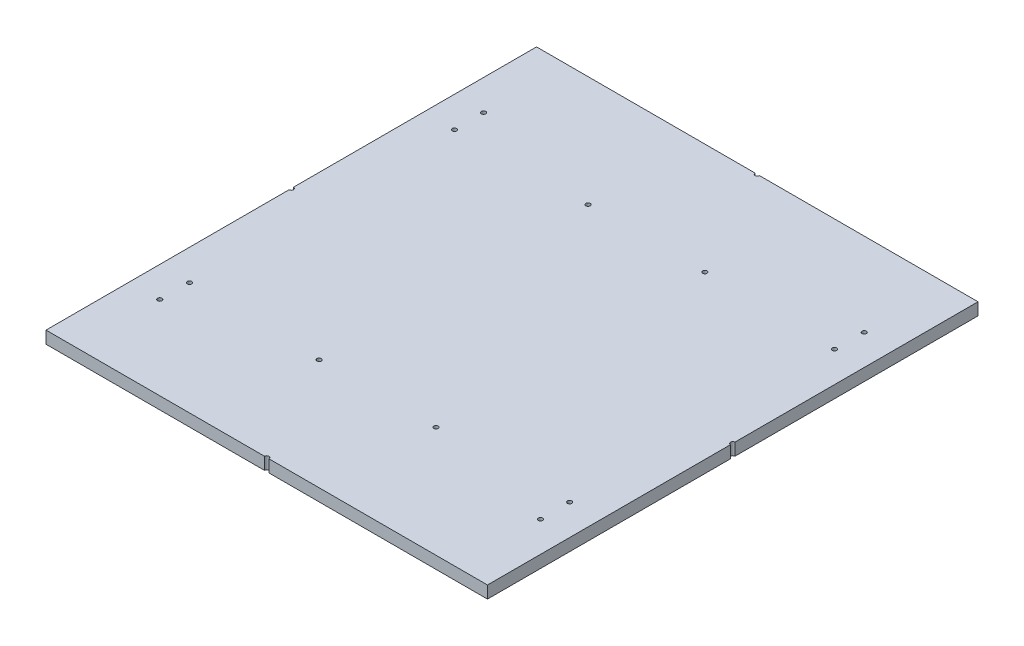
ISO-10303-21;
HEADER;
FILE_DESCRIPTION(('STEP AP214'),'2;1');
FILE_NAME('part.step','',(''),(''),'','','');
FILE_SCHEMA(('AUTOMOTIVE_DESIGN { 1 0 10303 214 1 1 1 1 }'));
ENDSEC;
DATA;
#1=APPLICATION_CONTEXT('core data for automotive mechanical design processes');
#2=APPLICATION_PROTOCOL_DEFINITION('international standard','automotive_design',2000,#1);
#3=PRODUCT_CONTEXT('',#1,'mechanical');
#4=PRODUCT('Part','Part','',(#3));
#5=PRODUCT_RELATED_PRODUCT_CATEGORY('part','',(#4));
#6=PRODUCT_DEFINITION_FORMATION('','',#4);
#7=PRODUCT_DEFINITION_CONTEXT('part definition',#1,'design');
#8=PRODUCT_DEFINITION('design','',#6,#7);
#9=PRODUCT_DEFINITION_SHAPE('','',#8);
#10=(LENGTH_UNIT() NAMED_UNIT(*) SI_UNIT(.MILLI.,.METRE.));
#11=(NAMED_UNIT(*) PLANE_ANGLE_UNIT() SI_UNIT($,.RADIAN.));
#12=(NAMED_UNIT(*) SI_UNIT($,.STERADIAN.) SOLID_ANGLE_UNIT());
#13=UNCERTAINTY_MEASURE_WITH_UNIT(LENGTH_MEASURE(1.E-05),#10,'distance_accuracy_value','');
#14=(GEOMETRIC_REPRESENTATION_CONTEXT(3) GLOBAL_UNCERTAINTY_ASSIGNED_CONTEXT((#13)) GLOBAL_UNIT_ASSIGNED_CONTEXT((#10,
#11,#12)) REPRESENTATION_CONTEXT('',''));
#15=CARTESIAN_POINT('',(0.,0.,0.));
#16=DIRECTION('',(0.,0.,1.));
#17=DIRECTION('',(1.,0.,0.));
#18=AXIS2_PLACEMENT_3D('',#15,#16,#17);
#19=CARTESIAN_POINT('',(0.,6.35,0.));
#20=DIRECTION('',(1.,0.,0.));
#21=DIRECTION('',(0.,0.,-1.));
#22=AXIS2_PLACEMENT_3D('',#19,#20,#21);
#23=PLANE('',#22);
#24=DIRECTION('',(0.,0.,1.));
#25=VECTOR('',#24,1.);
#26=CARTESIAN_POINT('',(0.,0.,0.));
#27=LINE('',#26,#25);
#28=CARTESIAN_POINT('',(0.,0.,-254.));
#29=VERTEX_POINT('',#28);
#30=CARTESIAN_POINT('',(0.,0.,-128.1303));
#31=VERTEX_POINT('',#30);
#32=EDGE_CURVE('E167',#29,#31,#27,.T.);
#33=ORIENTED_EDGE('',*,*,#32,.T.);
#34=DIRECTION('',(0.,1.,0.));
#35=VECTOR('',#34,1.);
#36=CARTESIAN_POINT('',(0.,6.35,-128.1303));
#37=LINE('',#36,#35);
#38=CARTESIAN_POINT('',(0.,6.35,-128.1303));
#39=VERTEX_POINT('',#38);
#40=EDGE_CURVE('E145',#31,#39,#37,.T.);
#41=ORIENTED_EDGE('',*,*,#40,.T.);
#42=DIRECTION('',(0.,0.,1.));
#43=VECTOR('',#42,1.);
#44=CARTESIAN_POINT('',(0.,6.35,0.));
#45=LINE('',#44,#43);
#46=CARTESIAN_POINT('',(0.,6.35,-254.));
#47=VERTEX_POINT('',#46);
#48=EDGE_CURVE('E236',#47,#39,#45,.T.);
#49=ORIENTED_EDGE('',*,*,#48,.F.);
#50=DIRECTION('',(0.,-1.,0.));
#51=VECTOR('',#50,1.);
#52=CARTESIAN_POINT('',(0.,6.35,-254.));
#53=LINE('',#52,#51);
#54=EDGE_CURVE('E193',#47,#29,#53,.T.);
#55=ORIENTED_EDGE('',*,*,#54,.T.);
#56=EDGE_LOOP('',(#33,#41,#49,#55));
#57=FACE_BOUND('',#56,.T.);
#58=ADVANCED_FACE('F52',(#57),#23,.F.);
#59=CARTESIAN_POINT('',(0.,0.,0.));
#60=DIRECTION('',(0.,-1.,0.));
#61=DIRECTION('',(0.,0.,-1.));
#62=AXIS2_PLACEMENT_3D('',#59,#60,#61);
#63=PLANE('',#62);
#64=CARTESIAN_POINT('',(15.7351594072584,0.,-43.18));
#65=DIRECTION('',(0.,1.,0.));
#66=DIRECTION('',(0.,0.,1.));
#67=AXIS2_PLACEMENT_3D('',#64,#65,#66);
#68=CIRCLE('',#67,1.1303);
#69=CARTESIAN_POINT('',(15.7351594072584,0.,-42.0497));
#70=VERTEX_POINT('',#69);
#71=EDGE_CURVE('E684',#70,#70,#68,.T.);
#72=ORIENTED_EDGE('',*,*,#71,.T.);
#73=EDGE_LOOP('',(#72));
#74=FACE_BOUND('',#73,.T.);
#75=CARTESIAN_POINT('',(15.8749999999998,0.,-58.42));
#76=DIRECTION('',(0.,1.,0.));
#77=DIRECTION('',(0.,0.,1.));
#78=AXIS2_PLACEMENT_3D('',#75,#76,#77);
#79=CIRCLE('',#78,1.1303);
#80=CARTESIAN_POINT('',(15.8749999999998,0.,-57.2897));
#81=VERTEX_POINT('',#80);
#82=EDGE_CURVE('E694',#81,#81,#79,.T.);
#83=ORIENTED_EDGE('',*,*,#82,.T.);
#84=EDGE_LOOP('',(#83));
#85=FACE_BOUND('',#84,.T.);
#86=CARTESIAN_POINT('',(84.0588414103042,0.,-57.3884371810008));
#87=DIRECTION('',(0.,1.,0.));
#88=DIRECTION('',(0.,0.,1.));
#89=AXIS2_PLACEMENT_3D('',#86,#87,#88);
#90=CIRCLE('',#89,1.1303);
#91=CARTESIAN_POINT('',(84.0588414103042,0.,-56.2581371810008));
#92=VERTEX_POINT('',#91);
#93=EDGE_CURVE('E703',#92,#92,#90,.T.);
#94=ORIENTED_EDGE('',*,*,#93,.T.);
#95=EDGE_LOOP('',(#94));
#96=FACE_BOUND('',#95,.T.);
#97=CARTESIAN_POINT('',(144.561688198213,0.,-57.3884371810008));
#98=DIRECTION('',(0.,1.,0.));
#99=DIRECTION('',(0.,0.,1.));
#100=AXIS2_PLACEMENT_3D('',#97,#98,#99);
#101=CIRCLE('',#100,1.1303);
#102=CARTESIAN_POINT('',(144.561688198213,0.,-56.2581371810008));
#103=VERTEX_POINT('',#102);
#104=EDGE_CURVE('E711',#103,#103,#101,.T.);
#105=ORIENTED_EDGE('',*,*,#104,.T.);
#106=EDGE_LOOP('',(#105));
#107=FACE_BOUND('',#106,.T.);
#108=CARTESIAN_POINT('',(0.,0.,-127.));
#109=DIRECTION('',(0.,1.,0.));
#110=DIRECTION('',(0.,0.,1.));
#111=AXIS2_PLACEMENT_3D('',#108,#109,#110);
#112=CIRCLE('',#111,1.1303);
#113=CARTESIAN_POINT('',(0.,0.,-125.8697));
#114=VERTEX_POINT('',#113);
#115=EDGE_CURVE('E143',#114,#31,#112,.T.);
#116=ORIENTED_EDGE('',*,*,#115,.T.);
#117=ORIENTED_EDGE('',*,*,#32,.F.);
#118=DIRECTION('',(-1.,0.,0.));
#119=VECTOR('',#118,1.);
#120=CARTESIAN_POINT('',(0.,0.,-254.));
#121=LINE('',#120,#119);
#122=CARTESIAN_POINT('',(113.1697,0.,-254.));
#123=VERTEX_POINT('',#122);
#124=EDGE_CURVE('E188',#123,#29,#121,.T.);
#125=ORIENTED_EDGE('',*,*,#124,.F.);
#126=CARTESIAN_POINT('',(114.3,0.,-254.));
#127=DIRECTION('',(0.,-1.,0.));
#128=DIRECTION('',(0.,0.,-1.));
#129=AXIS2_PLACEMENT_3D('',#126,#127,#128);
#130=CIRCLE('',#129,1.13029999999999);
#131=CARTESIAN_POINT('',(115.4303,0.,-254.));
#132=VERTEX_POINT('',#131);
#133=EDGE_CURVE('E206',#132,#123,#130,.T.);
#134=ORIENTED_EDGE('',*,*,#133,.F.);
#135=CARTESIAN_POINT('',(228.6,0.,-254.));
#136=VERTEX_POINT('',#135);
#137=EDGE_CURVE('E189',#136,#132,#121,.T.);
#138=ORIENTED_EDGE('',*,*,#137,.F.);
#139=DIRECTION('',(0.,0.,-1.));
#140=VECTOR('',#139,1.);
#141=CARTESIAN_POINT('',(228.6,0.,0.));
#142=LINE('',#141,#140);
#143=CARTESIAN_POINT('',(228.6,0.,-128.1303));
#144=VERTEX_POINT('',#143);
#145=EDGE_CURVE('E182',#144,#136,#142,.T.);
#146=ORIENTED_EDGE('',*,*,#145,.F.);
#147=CARTESIAN_POINT('',(228.6,0.,-127.));
#148=DIRECTION('',(0.,1.,0.));
#149=DIRECTION('',(0.,0.,1.));
#150=AXIS2_PLACEMENT_3D('',#147,#148,#149);
#151=CIRCLE('',#150,1.1303);
#152=CARTESIAN_POINT('',(228.6,0.,-125.8697));
#153=VERTEX_POINT('',#152);
#154=EDGE_CURVE('E209',#144,#153,#151,.T.);
#155=ORIENTED_EDGE('',*,*,#154,.T.);
#156=CARTESIAN_POINT('',(228.6,0.,0.));
#157=VERTEX_POINT('',#156);
#158=EDGE_CURVE('E185',#157,#153,#142,.T.);
#159=ORIENTED_EDGE('',*,*,#158,.F.);
#160=DIRECTION('',(1.,0.,0.));
#161=VECTOR('',#160,1.);
#162=CARTESIAN_POINT('',(0.,0.,0.));
#163=LINE('',#162,#161);
#164=CARTESIAN_POINT('',(115.4303,0.,0.));
#165=VERTEX_POINT('',#164);
#166=EDGE_CURVE('E173',#165,#157,#163,.T.);
#167=ORIENTED_EDGE('',*,*,#166,.F.);
#168=CARTESIAN_POINT('',(114.3,0.,0.));
#169=DIRECTION('',(0.,1.,0.));
#170=DIRECTION('',(0.,0.,1.));
#171=AXIS2_PLACEMENT_3D('',#168,#169,#170);
#172=CIRCLE('',#171,1.1303);
#173=CARTESIAN_POINT('',(113.1697,0.,0.));
#174=VERTEX_POINT('',#173);
#175=EDGE_CURVE('E79',#165,#174,#172,.T.);
#176=ORIENTED_EDGE('',*,*,#175,.T.);
#177=CARTESIAN_POINT('',(0.,0.,0.));
#178=VERTEX_POINT('',#177);
#179=EDGE_CURVE('E162',#178,#174,#163,.T.);
#180=ORIENTED_EDGE('',*,*,#179,.F.);
#181=EDGE_CURVE('E154',#114,#178,#27,.T.);
#182=ORIENTED_EDGE('',*,*,#181,.F.);
#183=EDGE_LOOP('',(#116,#117,#125,#134,#138,#146,#155,#159,#167,#176,#180,#182));
#184=FACE_BOUND('',#183,.T.);
#185=CARTESIAN_POINT('',(144.561688198213,0.,-196.611562818999));
#186=DIRECTION('',(0.,1.,0.));
#187=DIRECTION('',(0.,0.,1.));
#188=AXIS2_PLACEMENT_3D('',#185,#186,#187);
#189=CIRCLE('',#188,1.1303);
#190=CARTESIAN_POINT('',(144.561688198213,0.,-195.481262818999));
#191=VERTEX_POINT('',#190);
#192=EDGE_CURVE('E327',#191,#191,#189,.T.);
#193=ORIENTED_EDGE('',*,*,#192,.T.);
#194=EDGE_LOOP('',(#193));
#195=FACE_BOUND('',#194,.T.);
#196=CARTESIAN_POINT('',(84.0588414103042,0.,-196.611562818999));
#197=DIRECTION('',(0.,1.,0.));
#198=DIRECTION('',(0.,0.,1.));
#199=AXIS2_PLACEMENT_3D('',#196,#197,#198);
#200=CIRCLE('',#199,1.1303);
#201=CARTESIAN_POINT('',(84.0588414103042,0.,-195.481262818999));
#202=VERTEX_POINT('',#201);
#203=EDGE_CURVE('E337',#202,#202,#200,.T.);
#204=ORIENTED_EDGE('',*,*,#203,.T.);
#205=EDGE_LOOP('',(#204));
#206=FACE_BOUND('',#205,.T.);
#207=CARTESIAN_POINT('',(15.8749999999998,0.,-195.58));
#208=DIRECTION('',(0.,1.,0.));
#209=DIRECTION('',(0.,0.,1.));
#210=AXIS2_PLACEMENT_3D('',#207,#208,#209);
#211=CIRCLE('',#210,1.1303);
#212=CARTESIAN_POINT('',(15.8749999999998,0.,-194.4497));
#213=VERTEX_POINT('',#212);
#214=EDGE_CURVE('E347',#213,#213,#211,.T.);
#215=ORIENTED_EDGE('',*,*,#214,.T.);
#216=EDGE_LOOP('',(#215));
#217=FACE_BOUND('',#216,.T.);
#218=CARTESIAN_POINT('',(15.7351594072584,0.,-210.82));
#219=DIRECTION('',(0.,1.,0.));
#220=DIRECTION('',(0.,0.,1.));
#221=AXIS2_PLACEMENT_3D('',#218,#219,#220);
#222=CIRCLE('',#221,1.1303);
#223=CARTESIAN_POINT('',(15.7351594072584,0.,-209.6897));
#224=VERTEX_POINT('',#223);
#225=EDGE_CURVE('E355',#224,#224,#222,.T.);
#226=ORIENTED_EDGE('',*,*,#225,.T.);
#227=EDGE_LOOP('',(#226));
#228=FACE_BOUND('',#227,.T.);
#229=CARTESIAN_POINT('',(212.864840592742,0.,-43.18));
#230=DIRECTION('',(0.,1.,0.));
#231=DIRECTION('',(0.,0.,1.));
#232=AXIS2_PLACEMENT_3D('',#229,#230,#231);
#233=CIRCLE('',#232,1.1303);
#234=CARTESIAN_POINT('',(212.864840592742,0.,-42.0497));
#235=VERTEX_POINT('',#234);
#236=EDGE_CURVE('E370',#235,#235,#233,.T.);
#237=ORIENTED_EDGE('',*,*,#236,.T.);
#238=EDGE_LOOP('',(#237));
#239=FACE_BOUND('',#238,.T.);
#240=CARTESIAN_POINT('',(212.725,0.,-58.42));
#241=DIRECTION('',(0.,1.,0.));
#242=DIRECTION('',(0.,0.,1.));
#243=AXIS2_PLACEMENT_3D('',#240,#241,#242);
#244=CIRCLE('',#243,1.1303);
#245=CARTESIAN_POINT('',(212.725,0.,-57.2897));
#246=VERTEX_POINT('',#245);
#247=EDGE_CURVE('E374',#246,#246,#244,.T.);
#248=ORIENTED_EDGE('',*,*,#247,.T.);
#249=EDGE_LOOP('',(#248));
#250=FACE_BOUND('',#249,.T.);
#251=CARTESIAN_POINT('',(212.864840592742,0.,-210.82));
#252=DIRECTION('',(0.,1.,0.));
#253=DIRECTION('',(0.,0.,1.));
#254=AXIS2_PLACEMENT_3D('',#251,#252,#253);
#255=CIRCLE('',#254,1.1303);
#256=CARTESIAN_POINT('',(212.864840592742,0.,-209.6897));
#257=VERTEX_POINT('',#256);
#258=EDGE_CURVE('E382',#257,#257,#255,.T.);
#259=ORIENTED_EDGE('',*,*,#258,.T.);
#260=EDGE_LOOP('',(#259));
#261=FACE_BOUND('',#260,.T.);
#262=CARTESIAN_POINT('',(212.725,0.,-195.58));
#263=DIRECTION('',(0.,1.,0.));
#264=DIRECTION('',(0.,0.,1.));
#265=AXIS2_PLACEMENT_3D('',#262,#263,#264);
#266=CIRCLE('',#265,1.1303);
#267=CARTESIAN_POINT('',(212.725,0.,-194.4497));
#268=VERTEX_POINT('',#267);
#269=EDGE_CURVE('E227',#268,#268,#266,.T.);
#270=ORIENTED_EDGE('',*,*,#269,.T.);
#271=EDGE_LOOP('',(#270));
#272=FACE_BOUND('',#271,.T.);
#273=ADVANCED_FACE('F159',(#74,#85,#96,#107,#184,#195,#206,#217,#228,#239,#250,#261,#272),#63,.T.);
#274=CARTESIAN_POINT('',(0.,6.35,0.));
#275=DIRECTION('',(0.,-1.,0.));
#276=DIRECTION('',(0.,0.,-1.));
#277=AXIS2_PLACEMENT_3D('',#274,#275,#276);
#278=PLANE('',#277);
#279=CARTESIAN_POINT('',(15.7351594072584,6.35,-43.18));
#280=DIRECTION('',(0.,1.,0.));
#281=DIRECTION('',(0.,0.,1.));
#282=AXIS2_PLACEMENT_3D('',#279,#280,#281);
#283=CIRCLE('',#282,1.13029999999999);
#284=CARTESIAN_POINT('',(15.7351594072584,6.35,-42.0497));
#285=VERTEX_POINT('',#284);
#286=EDGE_CURVE('E681',#285,#285,#283,.T.);
#287=ORIENTED_EDGE('',*,*,#286,.F.);
#288=EDGE_LOOP('',(#287));
#289=FACE_BOUND('',#288,.T.);
#290=CARTESIAN_POINT('',(15.8749999999998,6.35,-58.42));
#291=DIRECTION('',(0.,1.,0.));
#292=DIRECTION('',(0.,0.,1.));
#293=AXIS2_PLACEMENT_3D('',#290,#291,#292);
#294=CIRCLE('',#293,1.13029999999999);
#295=CARTESIAN_POINT('',(15.8749999999998,6.35,-57.2897));
#296=VERTEX_POINT('',#295);
#297=EDGE_CURVE('E690',#296,#296,#294,.T.);
#298=ORIENTED_EDGE('',*,*,#297,.F.);
#299=EDGE_LOOP('',(#298));
#300=FACE_BOUND('',#299,.T.);
#301=CARTESIAN_POINT('',(84.0588414103042,6.35,-57.3884371810008));
#302=DIRECTION('',(0.,1.,0.));
#303=DIRECTION('',(0.,0.,1.));
#304=AXIS2_PLACEMENT_3D('',#301,#302,#303);
#305=CIRCLE('',#304,1.13029999999999);
#306=CARTESIAN_POINT('',(84.0588414103042,6.35,-56.2581371810008));
#307=VERTEX_POINT('',#306);
#308=EDGE_CURVE('E699',#307,#307,#305,.T.);
#309=ORIENTED_EDGE('',*,*,#308,.F.);
#310=EDGE_LOOP('',(#309));
#311=FACE_BOUND('',#310,.T.);
#312=CARTESIAN_POINT('',(144.561688198213,6.35,-57.3884371810008));
#313=DIRECTION('',(0.,1.,0.));
#314=DIRECTION('',(0.,0.,1.));
#315=AXIS2_PLACEMENT_3D('',#312,#313,#314);
#316=CIRCLE('',#315,1.1303);
#317=CARTESIAN_POINT('',(144.561688198213,6.35,-56.2581371810008));
#318=VERTEX_POINT('',#317);
#319=EDGE_CURVE('E710',#318,#318,#316,.T.);
#320=ORIENTED_EDGE('',*,*,#319,.F.);
#321=EDGE_LOOP('',(#320));
#322=FACE_BOUND('',#321,.T.);
#323=CARTESIAN_POINT('',(144.561688198213,6.35,-196.611562818999));
#324=DIRECTION('',(0.,1.,0.));
#325=DIRECTION('',(0.,0.,1.));
#326=AXIS2_PLACEMENT_3D('',#323,#324,#325);
#327=CIRCLE('',#326,1.1303);
#328=CARTESIAN_POINT('',(144.561688198213,6.35,-195.481262818999));
#329=VERTEX_POINT('',#328);
#330=EDGE_CURVE('E322',#329,#329,#327,.T.);
#331=ORIENTED_EDGE('',*,*,#330,.F.);
#332=EDGE_LOOP('',(#331));
#333=FACE_BOUND('',#332,.T.);
#334=CARTESIAN_POINT('',(84.0588414103042,6.35,-196.611562818999));
#335=DIRECTION('',(0.,1.,0.));
#336=DIRECTION('',(0.,0.,1.));
#337=AXIS2_PLACEMENT_3D('',#334,#335,#336);
#338=CIRCLE('',#337,1.13029999999999);
#339=CARTESIAN_POINT('',(84.0588414103042,6.35,-195.481262818999));
#340=VERTEX_POINT('',#339);
#341=EDGE_CURVE('E331',#340,#340,#338,.T.);
#342=ORIENTED_EDGE('',*,*,#341,.F.);
#343=EDGE_LOOP('',(#342));
#344=FACE_BOUND('',#343,.T.);
#345=CARTESIAN_POINT('',(15.8749999999998,6.35,-195.58));
#346=DIRECTION('',(0.,1.,0.));
#347=DIRECTION('',(0.,0.,1.));
#348=AXIS2_PLACEMENT_3D('',#345,#346,#347);
#349=CIRCLE('',#348,1.13029999999999);
#350=CARTESIAN_POINT('',(15.8749999999998,6.35,-194.4497));
#351=VERTEX_POINT('',#350);
#352=EDGE_CURVE('E344',#351,#351,#349,.T.);
#353=ORIENTED_EDGE('',*,*,#352,.F.);
#354=EDGE_LOOP('',(#353));
#355=FACE_BOUND('',#354,.T.);
#356=CARTESIAN_POINT('',(15.7351594072584,6.35,-210.82));
#357=DIRECTION('',(0.,1.,0.));
#358=DIRECTION('',(0.,0.,1.));
#359=AXIS2_PLACEMENT_3D('',#356,#357,#358);
#360=CIRCLE('',#359,1.13029999999999);
#361=CARTESIAN_POINT('',(15.7351594072584,6.35,-209.6897));
#362=VERTEX_POINT('',#361);
#363=EDGE_CURVE('E348',#362,#362,#360,.T.);
#364=ORIENTED_EDGE('',*,*,#363,.F.);
#365=EDGE_LOOP('',(#364));
#366=FACE_BOUND('',#365,.T.);
#367=CARTESIAN_POINT('',(212.725,6.35,-195.58));
#368=DIRECTION('',(0.,1.,0.));
#369=DIRECTION('',(0.,0.,1.));
#370=AXIS2_PLACEMENT_3D('',#367,#368,#369);
#371=CIRCLE('',#370,1.13029999999997);
#372=CARTESIAN_POINT('',(212.725,6.35,-194.4497));
#373=VERTEX_POINT('',#372);
#374=EDGE_CURVE('E390',#373,#373,#371,.T.);
#375=ORIENTED_EDGE('',*,*,#374,.F.);
#376=EDGE_LOOP('',(#375));
#377=FACE_BOUND('',#376,.T.);
#378=CARTESIAN_POINT('',(212.864840592742,6.35,-210.82));
#379=DIRECTION('',(0.,1.,0.));
#380=DIRECTION('',(0.,0.,1.));
#381=AXIS2_PLACEMENT_3D('',#378,#379,#380);
#382=CIRCLE('',#381,1.13029999999997);
#383=CARTESIAN_POINT('',(212.864840592742,6.35,-209.6897));
#384=VERTEX_POINT('',#383);
#385=EDGE_CURVE('E377',#384,#384,#382,.T.);
#386=ORIENTED_EDGE('',*,*,#385,.F.);
#387=EDGE_LOOP('',(#386));
#388=FACE_BOUND('',#387,.T.);
#389=CARTESIAN_POINT('',(212.725,6.35,-58.42));
#390=DIRECTION('',(0.,1.,0.));
#391=DIRECTION('',(0.,0.,1.));
#392=AXIS2_PLACEMENT_3D('',#389,#390,#391);
#393=CIRCLE('',#392,1.13029999999997);
#394=CARTESIAN_POINT('',(212.725,6.35,-57.2897));
#395=VERTEX_POINT('',#394);
#396=EDGE_CURVE('E371',#395,#395,#393,.T.);
#397=ORIENTED_EDGE('',*,*,#396,.F.);
#398=EDGE_LOOP('',(#397));
#399=FACE_BOUND('',#398,.T.);
#400=CARTESIAN_POINT('',(212.864840592742,6.35,-43.18));
#401=DIRECTION('',(0.,1.,0.));
#402=DIRECTION('',(0.,0.,1.));
#403=AXIS2_PLACEMENT_3D('',#400,#401,#402);
#404=CIRCLE('',#403,1.13029999999997);
#405=CARTESIAN_POINT('',(212.864840592742,6.35,-42.0497));
#406=VERTEX_POINT('',#405);
#407=EDGE_CURVE('E361',#406,#406,#404,.T.);
#408=ORIENTED_EDGE('',*,*,#407,.F.);
#409=EDGE_LOOP('',(#408));
#410=FACE_BOUND('',#409,.T.);
#411=ORIENTED_EDGE('',*,*,#48,.T.);
#412=CARTESIAN_POINT('',(0.,6.35,-127.));
#413=DIRECTION('',(0.,1.,0.));
#414=DIRECTION('',(0.,0.,1.));
#415=AXIS2_PLACEMENT_3D('',#412,#413,#414);
#416=CIRCLE('',#415,1.13029999999999);
#417=CARTESIAN_POINT('',(0.,6.35,-125.8697));
#418=VERTEX_POINT('',#417);
#419=EDGE_CURVE('E147',#418,#39,#416,.T.);
#420=ORIENTED_EDGE('',*,*,#419,.F.);
#421=CARTESIAN_POINT('',(0.,6.35,0.));
#422=VERTEX_POINT('',#421);
#423=EDGE_CURVE('E160',#418,#422,#45,.T.);
#424=ORIENTED_EDGE('',*,*,#423,.T.);
#425=DIRECTION('',(1.,0.,0.));
#426=VECTOR('',#425,1.);
#427=CARTESIAN_POINT('',(0.,6.35,0.));
#428=LINE('',#427,#426);
#429=CARTESIAN_POINT('',(113.1697,6.35,0.));
#430=VERTEX_POINT('',#429);
#431=EDGE_CURVE('E242',#422,#430,#428,.T.);
#432=ORIENTED_EDGE('',*,*,#431,.T.);
#433=CARTESIAN_POINT('',(114.3,6.35,0.));
#434=DIRECTION('',(0.,1.,0.));
#435=DIRECTION('',(0.,0.,1.));
#436=AXIS2_PLACEMENT_3D('',#433,#434,#435);
#437=CIRCLE('',#436,1.13029999999999);
#438=CARTESIAN_POINT('',(115.4303,6.35,0.));
#439=VERTEX_POINT('',#438);
#440=EDGE_CURVE('E357',#439,#430,#437,.T.);
#441=ORIENTED_EDGE('',*,*,#440,.F.);
#442=CARTESIAN_POINT('',(228.6,6.35,0.));
#443=VERTEX_POINT('',#442);
#444=EDGE_CURVE('E244',#439,#443,#428,.T.);
#445=ORIENTED_EDGE('',*,*,#444,.T.);
#446=DIRECTION('',(0.,0.,-1.));
#447=VECTOR('',#446,1.);
#448=CARTESIAN_POINT('',(228.6,6.35,0.));
#449=LINE('',#448,#447);
#450=CARTESIAN_POINT('',(228.6,6.35,-125.8697));
#451=VERTEX_POINT('',#450);
#452=EDGE_CURVE('E249',#443,#451,#449,.T.);
#453=ORIENTED_EDGE('',*,*,#452,.T.);
#454=CARTESIAN_POINT('',(228.6,6.35,-127.));
#455=DIRECTION('',(0.,1.,0.));
#456=DIRECTION('',(0.,0.,1.));
#457=AXIS2_PLACEMENT_3D('',#454,#455,#456);
#458=CIRCLE('',#457,1.13029999999997);
#459=CARTESIAN_POINT('',(228.6,6.35,-128.1303));
#460=VERTEX_POINT('',#459);
#461=EDGE_CURVE('E208',#460,#451,#458,.T.);
#462=ORIENTED_EDGE('',*,*,#461,.F.);
#463=CARTESIAN_POINT('',(228.6,6.35,-254.));
#464=VERTEX_POINT('',#463);
#465=EDGE_CURVE('E248',#460,#464,#449,.T.);
#466=ORIENTED_EDGE('',*,*,#465,.T.);
#467=DIRECTION('',(-1.,0.,0.));
#468=VECTOR('',#467,1.);
#469=CARTESIAN_POINT('',(0.,6.35,-254.));
#470=LINE('',#469,#468);
#471=CARTESIAN_POINT('',(115.4303,6.35,-254.));
#472=VERTEX_POINT('',#471);
#473=EDGE_CURVE('E179',#464,#472,#470,.T.);
#474=ORIENTED_EDGE('',*,*,#473,.T.);
#475=CARTESIAN_POINT('',(114.3,6.35,-254.));
#476=DIRECTION('',(0.,1.,0.));
#477=DIRECTION('',(0.,0.,1.));
#478=AXIS2_PLACEMENT_3D('',#475,#476,#477);
#479=CIRCLE('',#478,1.13029999999999);
#480=CARTESIAN_POINT('',(113.1697,6.35,-254.));
#481=VERTEX_POINT('',#480);
#482=EDGE_CURVE('E234',#481,#472,#479,.T.);
#483=ORIENTED_EDGE('',*,*,#482,.F.);
#484=EDGE_CURVE('E246',#481,#47,#470,.T.);
#485=ORIENTED_EDGE('',*,*,#484,.T.);
#486=EDGE_LOOP('',(#411,#420,#424,#432,#441,#445,#453,#462,#466,#474,#483,#485));
#487=FACE_BOUND('',#486,.T.);
#488=ADVANCED_FACE('F259',(#289,#300,#311,#322,#333,#344,#355,#366,#377,#388,#399,#410,#487),
#278,.F.);
#489=CARTESIAN_POINT('',(0.,6.35,0.));
#490=DIRECTION('',(0.,0.,-1.));
#491=DIRECTION('',(-1.,0.,0.));
#492=AXIS2_PLACEMENT_3D('',#489,#490,#491);
#493=PLANE('',#492);
#494=ORIENTED_EDGE('',*,*,#179,.T.);
#495=DIRECTION('',(0.,1.,0.));
#496=VECTOR('',#495,1.);
#497=CARTESIAN_POINT('',(113.1697,6.35,0.));
#498=LINE('',#497,#496);
#499=EDGE_CURVE('E11',#174,#430,#498,.T.);
#500=ORIENTED_EDGE('',*,*,#499,.T.);
#501=ORIENTED_EDGE('',*,*,#431,.F.);
#502=DIRECTION('',(0.,-1.,0.));
#503=VECTOR('',#502,1.);
#504=CARTESIAN_POINT('',(0.,6.35,0.));
#505=LINE('',#504,#503);
#506=EDGE_CURVE('E201',#422,#178,#505,.T.);
#507=ORIENTED_EDGE('',*,*,#506,.T.);
#508=EDGE_LOOP('',(#494,#500,#501,#507));
#509=FACE_BOUND('',#508,.T.);
#510=ADVANCED_FACE('F309',(#509),#493,.F.);
#511=CARTESIAN_POINT('',(228.6,6.35,0.));
#512=DIRECTION('',(-1.,0.,0.));
#513=DIRECTION('',(0.,0.,1.));
#514=AXIS2_PLACEMENT_3D('',#511,#512,#513);
#515=PLANE('',#514);
#516=ORIENTED_EDGE('',*,*,#158,.T.);
#517=DIRECTION('',(0.,1.,0.));
#518=VECTOR('',#517,1.);
#519=CARTESIAN_POINT('',(228.6,6.35,-125.8697));
#520=LINE('',#519,#518);
#521=EDGE_CURVE('E229',#153,#451,#520,.T.);
#522=ORIENTED_EDGE('',*,*,#521,.T.);
#523=ORIENTED_EDGE('',*,*,#452,.F.);
#524=DIRECTION('',(0.,-1.,0.));
#525=VECTOR('',#524,1.);
#526=CARTESIAN_POINT('',(228.6,6.35,0.));
#527=LINE('',#526,#525);
#528=EDGE_CURVE('E200',#443,#157,#527,.T.);
#529=ORIENTED_EDGE('',*,*,#528,.T.);
#530=EDGE_LOOP('',(#516,#522,#523,#529));
#531=FACE_BOUND('',#530,.T.);
#532=ADVANCED_FACE('F283',(#531),#515,.F.);
#533=CARTESIAN_POINT('',(0.,6.35,-254.));
#534=DIRECTION('',(0.,0.,1.));
#535=DIRECTION('',(1.,0.,0.));
#536=AXIS2_PLACEMENT_3D('',#533,#534,#535);
#537=PLANE('',#536);
#538=ORIENTED_EDGE('',*,*,#137,.T.);
#539=DIRECTION('',(0.,1.,0.));
#540=VECTOR('',#539,1.);
#541=CARTESIAN_POINT('',(115.4303,6.35,-254.));
#542=LINE('',#541,#540);
#543=EDGE_CURVE('E170',#132,#472,#542,.T.);
#544=ORIENTED_EDGE('',*,*,#543,.T.);
#545=ORIENTED_EDGE('',*,*,#473,.F.);
#546=DIRECTION('',(0.,-1.,0.));
#547=VECTOR('',#546,1.);
#548=CARTESIAN_POINT('',(228.6,6.35,-254.));
#549=LINE('',#548,#547);
#550=EDGE_CURVE('E191',#464,#136,#549,.T.);
#551=ORIENTED_EDGE('',*,*,#550,.T.);
#552=EDGE_LOOP('',(#538,#544,#545,#551));
#553=FACE_BOUND('',#552,.T.);
#554=ADVANCED_FACE('F266',(#553),#537,.F.);
#555=ORIENTED_EDGE('',*,*,#423,.F.);
#556=DIRECTION('',(0.,1.,0.));
#557=VECTOR('',#556,1.);
#558=CARTESIAN_POINT('',(0.,6.35,-125.8697));
#559=LINE('',#558,#557);
#560=EDGE_CURVE('E70',#418,#114,#559,.F.);
#561=ORIENTED_EDGE('',*,*,#560,.T.);
#562=ORIENTED_EDGE('',*,*,#181,.T.);
#563=ORIENTED_EDGE('',*,*,#506,.F.);
#564=EDGE_LOOP('',(#555,#561,#562,#563));
#565=FACE_BOUND('',#564,.T.);
#566=ADVANCED_FACE('F54',(#565),#23,.F.);
#567=ORIENTED_EDGE('',*,*,#444,.F.);
#568=DIRECTION('',(0.,1.,0.));
#569=VECTOR('',#568,1.);
#570=CARTESIAN_POINT('',(115.4303,6.35,0.));
#571=LINE('',#570,#569);
#572=EDGE_CURVE('E64',#439,#165,#571,.F.);
#573=ORIENTED_EDGE('',*,*,#572,.T.);
#574=ORIENTED_EDGE('',*,*,#166,.T.);
#575=ORIENTED_EDGE('',*,*,#528,.F.);
#576=EDGE_LOOP('',(#567,#573,#574,#575));
#577=FACE_BOUND('',#576,.T.);
#578=ADVANCED_FACE('F276',(#577),#493,.F.);
#579=ORIENTED_EDGE('',*,*,#465,.F.);
#580=DIRECTION('',(0.,1.,0.));
#581=VECTOR('',#580,1.);
#582=CARTESIAN_POINT('',(228.6,6.35,-128.1303));
#583=LINE('',#582,#581);
#584=EDGE_CURVE('E224',#460,#144,#583,.F.);
#585=ORIENTED_EDGE('',*,*,#584,.T.);
#586=ORIENTED_EDGE('',*,*,#145,.T.);
#587=ORIENTED_EDGE('',*,*,#550,.F.);
#588=EDGE_LOOP('',(#579,#585,#586,#587));
#589=FACE_BOUND('',#588,.T.);
#590=ADVANCED_FACE('F263',(#589),#515,.F.);
#591=ORIENTED_EDGE('',*,*,#484,.F.);
#592=DIRECTION('',(0.,1.,0.));
#593=VECTOR('',#592,1.);
#594=CARTESIAN_POINT('',(113.1697,6.35,-254.));
#595=LINE('',#594,#593);
#596=EDGE_CURVE('E172',#481,#123,#595,.F.);
#597=ORIENTED_EDGE('',*,*,#596,.T.);
#598=ORIENTED_EDGE('',*,*,#124,.T.);
#599=ORIENTED_EDGE('',*,*,#54,.F.);
#600=EDGE_LOOP('',(#591,#597,#598,#599));
#601=FACE_BOUND('',#600,.T.);
#602=ADVANCED_FACE('F298',(#601),#537,.F.);
#603=CARTESIAN_POINT('',(114.3,6.35,-254.));
#604=DIRECTION('',(0.,1.,0.));
#605=DIRECTION('',(0.,0.,1.));
#606=AXIS2_PLACEMENT_3D('',#603,#604,#605);
#607=CYLINDRICAL_SURFACE('',#606,1.13029999999999);
#608=ORIENTED_EDGE('',*,*,#133,.T.);
#609=ORIENTED_EDGE('',*,*,#596,.F.);
#610=ORIENTED_EDGE('',*,*,#482,.T.);
#611=ORIENTED_EDGE('',*,*,#543,.F.);
#612=EDGE_LOOP('',(#608,#609,#610,#611));
#613=FACE_BOUND('',#612,.T.);
#614=ADVANCED_FACE('F269',(#613),#607,.F.);
#615=CARTESIAN_POINT('',(228.6,6.35,-127.));
#616=DIRECTION('',(0.,1.,0.));
#617=DIRECTION('',(0.,0.,1.));
#618=AXIS2_PLACEMENT_3D('',#615,#616,#617);
#619=CYLINDRICAL_SURFACE('',#618,1.13029999999999);
#620=ORIENTED_EDGE('',*,*,#154,.F.);
#621=ORIENTED_EDGE('',*,*,#584,.F.);
#622=ORIENTED_EDGE('',*,*,#461,.T.);
#623=ORIENTED_EDGE('',*,*,#521,.F.);
#624=EDGE_LOOP('',(#620,#621,#622,#623));
#625=FACE_BOUND('',#624,.T.);
#626=ADVANCED_FACE('F282',(#625),#619,.F.);
#627=CARTESIAN_POINT('',(212.725,6.35,-195.58));
#628=DIRECTION('',(0.,1.,0.));
#629=DIRECTION('',(0.,0.,1.));
#630=AXIS2_PLACEMENT_3D('',#627,#628,#629);
#631=CYLINDRICAL_SURFACE('',#630,1.13029999999999);
#632=ORIENTED_EDGE('',*,*,#269,.F.);
#633=EDGE_LOOP('',(#632));
#634=FACE_BOUND('',#633,.T.);
#635=ORIENTED_EDGE('',*,*,#374,.T.);
#636=EDGE_LOOP('',(#635));
#637=FACE_BOUND('',#636,.T.);
#638=ADVANCED_FACE('F281',(#634,#637),#631,.F.);
#639=CARTESIAN_POINT('',(212.864840592742,6.35,-210.82));
#640=DIRECTION('',(0.,1.,0.));
#641=DIRECTION('',(0.,0.,1.));
#642=AXIS2_PLACEMENT_3D('',#639,#640,#641);
#643=CYLINDRICAL_SURFACE('',#642,1.13029999999999);
#644=ORIENTED_EDGE('',*,*,#258,.F.);
#645=EDGE_LOOP('',(#644));
#646=FACE_BOUND('',#645,.T.);
#647=ORIENTED_EDGE('',*,*,#385,.T.);
#648=EDGE_LOOP('',(#647));
#649=FACE_BOUND('',#648,.T.);
#650=ADVANCED_FACE('F295',(#646,#649),#643,.F.);
#651=CARTESIAN_POINT('',(212.725,6.35,-58.42));
#652=DIRECTION('',(0.,1.,0.));
#653=DIRECTION('',(0.,0.,1.));
#654=AXIS2_PLACEMENT_3D('',#651,#652,#653);
#655=CYLINDRICAL_SURFACE('',#654,1.13029999999999);
#656=ORIENTED_EDGE('',*,*,#247,.F.);
#657=EDGE_LOOP('',(#656));
#658=FACE_BOUND('',#657,.T.);
#659=ORIENTED_EDGE('',*,*,#396,.T.);
#660=EDGE_LOOP('',(#659));
#661=FACE_BOUND('',#660,.T.);
#662=ADVANCED_FACE('F406',(#658,#661),#655,.F.);
#663=CARTESIAN_POINT('',(212.864840592742,6.35,-43.18));
#664=DIRECTION('',(0.,1.,0.));
#665=DIRECTION('',(0.,0.,1.));
#666=AXIS2_PLACEMENT_3D('',#663,#664,#665);
#667=CYLINDRICAL_SURFACE('',#666,1.13029999999999);
#668=ORIENTED_EDGE('',*,*,#236,.F.);
#669=EDGE_LOOP('',(#668));
#670=FACE_BOUND('',#669,.T.);
#671=ORIENTED_EDGE('',*,*,#407,.T.);
#672=EDGE_LOOP('',(#671));
#673=FACE_BOUND('',#672,.T.);
#674=ADVANCED_FACE('F409',(#670,#673),#667,.F.);
#675=CARTESIAN_POINT('',(114.3,6.35,0.));
#676=DIRECTION('',(0.,1.,0.));
#677=DIRECTION('',(0.,0.,1.));
#678=AXIS2_PLACEMENT_3D('',#675,#676,#677);
#679=CYLINDRICAL_SURFACE('',#678,1.13029999999999);
#680=ORIENTED_EDGE('',*,*,#175,.F.);
#681=ORIENTED_EDGE('',*,*,#572,.F.);
#682=ORIENTED_EDGE('',*,*,#440,.T.);
#683=ORIENTED_EDGE('',*,*,#499,.F.);
#684=EDGE_LOOP('',(#680,#681,#682,#683));
#685=FACE_BOUND('',#684,.T.);
#686=ADVANCED_FACE('F410',(#685),#679,.F.);
#687=CARTESIAN_POINT('',(15.7351594072584,6.35,-210.82));
#688=DIRECTION('',(0.,1.,0.));
#689=DIRECTION('',(0.,0.,1.));
#690=AXIS2_PLACEMENT_3D('',#687,#688,#689);
#691=CYLINDRICAL_SURFACE('',#690,1.13029999999999);
#692=ORIENTED_EDGE('',*,*,#225,.F.);
#693=EDGE_LOOP('',(#692));
#694=FACE_BOUND('',#693,.T.);
#695=ORIENTED_EDGE('',*,*,#363,.T.);
#696=EDGE_LOOP('',(#695));
#697=FACE_BOUND('',#696,.T.);
#698=ADVANCED_FACE('F416',(#694,#697),#691,.F.);
#699=CARTESIAN_POINT('',(15.8749999999998,6.35,-195.58));
#700=DIRECTION('',(0.,1.,0.));
#701=DIRECTION('',(0.,0.,1.));
#702=AXIS2_PLACEMENT_3D('',#699,#700,#701);
#703=CYLINDRICAL_SURFACE('',#702,1.13029999999999);
#704=ORIENTED_EDGE('',*,*,#214,.F.);
#705=EDGE_LOOP('',(#704));
#706=FACE_BOUND('',#705,.T.);
#707=ORIENTED_EDGE('',*,*,#352,.T.);
#708=EDGE_LOOP('',(#707));
#709=FACE_BOUND('',#708,.T.);
#710=ADVANCED_FACE('F469',(#706,#709),#703,.F.);
#711=CARTESIAN_POINT('',(84.0588414103042,6.35,-196.611562818999));
#712=DIRECTION('',(0.,1.,0.));
#713=DIRECTION('',(0.,0.,1.));
#714=AXIS2_PLACEMENT_3D('',#711,#712,#713);
#715=CYLINDRICAL_SURFACE('',#714,1.13029999999999);
#716=ORIENTED_EDGE('',*,*,#203,.F.);
#717=EDGE_LOOP('',(#716));
#718=FACE_BOUND('',#717,.T.);
#719=ORIENTED_EDGE('',*,*,#341,.T.);
#720=EDGE_LOOP('',(#719));
#721=FACE_BOUND('',#720,.T.);
#722=ADVANCED_FACE('F476',(#718,#721),#715,.F.);
#723=CARTESIAN_POINT('',(144.561688198213,6.35,-196.611562818999));
#724=DIRECTION('',(0.,1.,0.));
#725=DIRECTION('',(0.,0.,1.));
#726=AXIS2_PLACEMENT_3D('',#723,#724,#725);
#727=CYLINDRICAL_SURFACE('',#726,1.1303);
#728=ORIENTED_EDGE('',*,*,#192,.F.);
#729=EDGE_LOOP('',(#728));
#730=FACE_BOUND('',#729,.T.);
#731=ORIENTED_EDGE('',*,*,#330,.T.);
#732=EDGE_LOOP('',(#731));
#733=FACE_BOUND('',#732,.T.);
#734=ADVANCED_FACE('F487',(#730,#733),#727,.F.);
#735=CARTESIAN_POINT('',(0.,6.35,-127.));
#736=DIRECTION('',(0.,1.,0.));
#737=DIRECTION('',(0.,0.,1.));
#738=AXIS2_PLACEMENT_3D('',#735,#736,#737);
#739=CYLINDRICAL_SURFACE('',#738,1.13029999999999);
#740=ORIENTED_EDGE('',*,*,#115,.F.);
#741=ORIENTED_EDGE('',*,*,#560,.F.);
#742=ORIENTED_EDGE('',*,*,#419,.T.);
#743=ORIENTED_EDGE('',*,*,#40,.F.);
#744=EDGE_LOOP('',(#740,#741,#742,#743));
#745=FACE_BOUND('',#744,.T.);
#746=ADVANCED_FACE('F142',(#745),#739,.F.);
#747=CARTESIAN_POINT('',(144.561688198213,6.35,-57.3884371810008));
#748=DIRECTION('',(0.,1.,0.));
#749=DIRECTION('',(0.,0.,1.));
#750=AXIS2_PLACEMENT_3D('',#747,#748,#749);
#751=CYLINDRICAL_SURFACE('',#750,1.1303);
#752=ORIENTED_EDGE('',*,*,#104,.F.);
#753=EDGE_LOOP('',(#752));
#754=FACE_BOUND('',#753,.T.);
#755=ORIENTED_EDGE('',*,*,#319,.T.);
#756=EDGE_LOOP('',(#755));
#757=FACE_BOUND('',#756,.T.);
#758=ADVANCED_FACE('F511',(#754,#757),#751,.F.);
#759=CARTESIAN_POINT('',(84.0588414103042,6.35,-57.3884371810008));
#760=DIRECTION('',(0.,1.,0.));
#761=DIRECTION('',(0.,0.,1.));
#762=AXIS2_PLACEMENT_3D('',#759,#760,#761);
#763=CYLINDRICAL_SURFACE('',#762,1.13029999999999);
#764=ORIENTED_EDGE('',*,*,#93,.F.);
#765=EDGE_LOOP('',(#764));
#766=FACE_BOUND('',#765,.T.);
#767=ORIENTED_EDGE('',*,*,#308,.T.);
#768=EDGE_LOOP('',(#767));
#769=FACE_BOUND('',#768,.T.);
#770=ADVANCED_FACE('F525',(#766,#769),#763,.F.);
#771=CARTESIAN_POINT('',(15.8749999999998,6.35,-58.42));
#772=DIRECTION('',(0.,1.,0.));
#773=DIRECTION('',(0.,0.,1.));
#774=AXIS2_PLACEMENT_3D('',#771,#772,#773);
#775=CYLINDRICAL_SURFACE('',#774,1.13029999999999);
#776=ORIENTED_EDGE('',*,*,#82,.F.);
#777=EDGE_LOOP('',(#776));
#778=FACE_BOUND('',#777,.T.);
#779=ORIENTED_EDGE('',*,*,#297,.T.);
#780=EDGE_LOOP('',(#779));
#781=FACE_BOUND('',#780,.T.);
#782=ADVANCED_FACE('F536',(#778,#781),#775,.F.);
#783=CARTESIAN_POINT('',(15.7351594072584,6.35,-43.18));
#784=DIRECTION('',(0.,1.,0.));
#785=DIRECTION('',(0.,0.,1.));
#786=AXIS2_PLACEMENT_3D('',#783,#784,#785);
#787=CYLINDRICAL_SURFACE('',#786,1.13029999999999);
#788=ORIENTED_EDGE('',*,*,#71,.F.);
#789=EDGE_LOOP('',(#788));
#790=FACE_BOUND('',#789,.T.);
#791=ORIENTED_EDGE('',*,*,#286,.T.);
#792=EDGE_LOOP('',(#791));
#793=FACE_BOUND('',#792,.T.);
#794=ADVANCED_FACE('F547',(#790,#793),#787,.F.);
#795=CLOSED_SHELL('',(#58,#273,#488,#510,#532,#554,#566,#578,#590,#602,#614,#626,#638,#650,#662,
#674,#686,#698,#710,#722,#734,#746,#758,#770,#782,#794));
#796=MANIFOLD_SOLID_BREP('B2',#795);
#797=ADVANCED_BREP_SHAPE_REPRESENTATION('',(#18,#796),#14);
#798=SHAPE_DEFINITION_REPRESENTATION(#9,#797);
ENDSEC;
END-ISO-10303-21;
